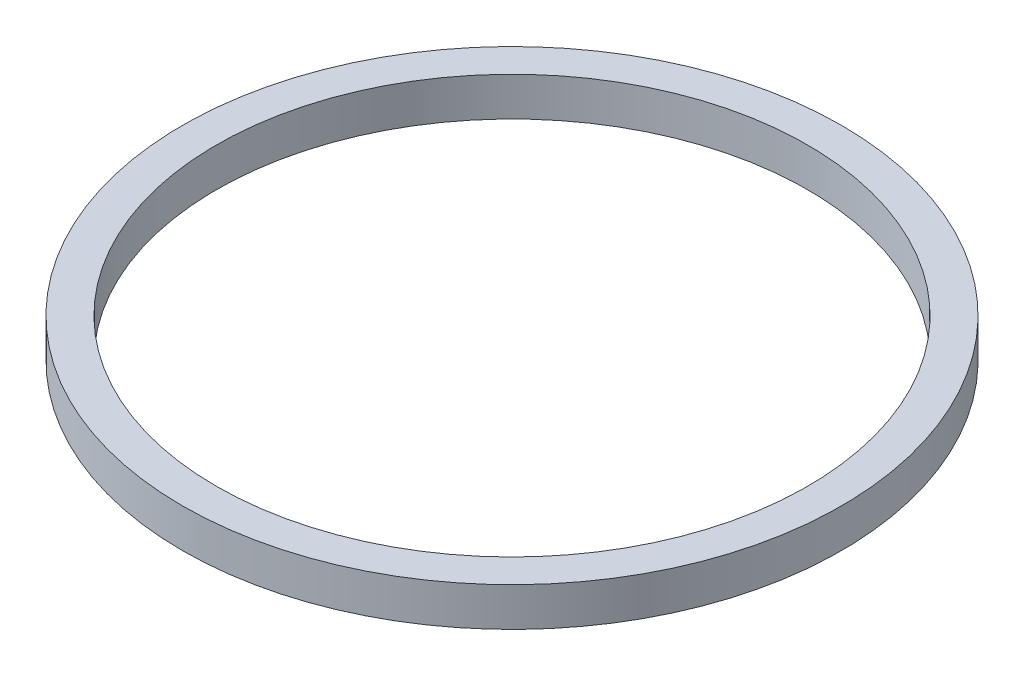
ISO-10303-21;
HEADER;
FILE_DESCRIPTION(('STEP AP214'),'2;1');
FILE_NAME('part.step','',(''),(''),'','','');
FILE_SCHEMA(('AUTOMOTIVE_DESIGN { 1 0 10303 214 1 1 1 1 }'));
ENDSEC;
DATA;
#1=APPLICATION_CONTEXT('core data for automotive mechanical design processes');
#2=APPLICATION_PROTOCOL_DEFINITION('international standard','automotive_design',2000,#1);
#3=PRODUCT_CONTEXT('',#1,'mechanical');
#4=PRODUCT('Part','Part','',(#3));
#5=PRODUCT_RELATED_PRODUCT_CATEGORY('part','',(#4));
#6=PRODUCT_DEFINITION_FORMATION('','',#4);
#7=PRODUCT_DEFINITION_CONTEXT('part definition',#1,'design');
#8=PRODUCT_DEFINITION('design','',#6,#7);
#9=PRODUCT_DEFINITION_SHAPE('','',#8);
#10=(LENGTH_UNIT() NAMED_UNIT(*) SI_UNIT(.MILLI.,.METRE.));
#11=(NAMED_UNIT(*) PLANE_ANGLE_UNIT() SI_UNIT($,.RADIAN.));
#12=(NAMED_UNIT(*) SI_UNIT($,.STERADIAN.) SOLID_ANGLE_UNIT());
#13=UNCERTAINTY_MEASURE_WITH_UNIT(LENGTH_MEASURE(1.E-05),#10,'distance_accuracy_value','');
#14=(GEOMETRIC_REPRESENTATION_CONTEXT(3) GLOBAL_UNCERTAINTY_ASSIGNED_CONTEXT((#13)) GLOBAL_UNIT_ASSIGNED_CONTEXT((#10,
#11,#12)) REPRESENTATION_CONTEXT('',''));
#15=CARTESIAN_POINT('',(0.,0.,0.));
#16=DIRECTION('',(0.,0.,1.));
#17=DIRECTION('',(1.,0.,0.));
#18=AXIS2_PLACEMENT_3D('',#15,#16,#17);
#19=CARTESIAN_POINT('',(0.,0.2,0.));
#20=DIRECTION('',(0.,1.,0.));
#21=DIRECTION('',(0.,0.,1.));
#22=AXIS2_PLACEMENT_3D('',#19,#20,#21);
#23=PLANE('',#22);
#24=CARTESIAN_POINT('',(0.,0.2,0.));
#25=DIRECTION('',(0.,1.,0.));
#26=DIRECTION('',(0.,0.,1.));
#27=AXIS2_PLACEMENT_3D('',#24,#25,#26);
#28=CIRCLE('',#27,3.4);
#29=CARTESIAN_POINT('',(0.,0.2,3.4));
#30=VERTEX_POINT('',#29);
#31=EDGE_CURVE('E11',#30,#30,#28,.T.);
#32=ORIENTED_EDGE('',*,*,#31,.T.);
#33=EDGE_LOOP('',(#32));
#34=FACE_BOUND('',#33,.T.);
#35=CARTESIAN_POINT('',(0.,0.2,0.));
#36=DIRECTION('',(0.,1.,0.));
#37=DIRECTION('',(0.,0.,1.));
#38=AXIS2_PLACEMENT_3D('',#35,#36,#37);
#39=CIRCLE('',#38,3.05);
#40=CARTESIAN_POINT('',(0.,0.2,3.05));
#41=VERTEX_POINT('',#40);
#42=EDGE_CURVE('E50',#41,#41,#39,.T.);
#43=ORIENTED_EDGE('',*,*,#42,.F.);
#44=EDGE_LOOP('',(#43));
#45=FACE_BOUND('',#44,.T.);
#46=ADVANCED_FACE('F39',(#34,#45),#23,.T.);
#47=CARTESIAN_POINT('',(0.,-0.2,0.));
#48=DIRECTION('',(0.,1.,0.));
#49=DIRECTION('',(0.,0.,1.));
#50=AXIS2_PLACEMENT_3D('',#47,#48,#49);
#51=PLANE('',#50);
#52=CARTESIAN_POINT('',(0.,-0.2,0.));
#53=DIRECTION('',(0.,1.,0.));
#54=DIRECTION('',(0.,0.,1.));
#55=AXIS2_PLACEMENT_3D('',#52,#53,#54);
#56=CIRCLE('',#55,3.4);
#57=CARTESIAN_POINT('',(0.,-0.2,3.4));
#58=VERTEX_POINT('',#57);
#59=EDGE_CURVE('E43',#58,#58,#56,.T.);
#60=ORIENTED_EDGE('',*,*,#59,.F.);
#61=EDGE_LOOP('',(#60));
#62=FACE_BOUND('',#61,.T.);
#63=CARTESIAN_POINT('',(0.,-0.2,0.));
#64=DIRECTION('',(0.,1.,0.));
#65=DIRECTION('',(0.,0.,1.));
#66=AXIS2_PLACEMENT_3D('',#63,#64,#65);
#67=CIRCLE('',#66,3.05);
#68=CARTESIAN_POINT('',(0.,-0.2,3.05));
#69=VERTEX_POINT('',#68);
#70=EDGE_CURVE('E52',#69,#69,#67,.T.);
#71=ORIENTED_EDGE('',*,*,#70,.T.);
#72=EDGE_LOOP('',(#71));
#73=FACE_BOUND('',#72,.T.);
#74=ADVANCED_FACE('F62',(#62,#73),#51,.F.);
#75=CARTESIAN_POINT('',(0.,0.2,0.));
#76=DIRECTION('',(0.,-1.,0.));
#77=DIRECTION('',(0.,0.,-1.));
#78=AXIS2_PLACEMENT_3D('',#75,#76,#77);
#79=CYLINDRICAL_SURFACE('',#78,3.4);
#80=ORIENTED_EDGE('',*,*,#31,.F.);
#81=EDGE_LOOP('',(#80));
#82=FACE_BOUND('',#81,.T.);
#83=ORIENTED_EDGE('',*,*,#59,.T.);
#84=EDGE_LOOP('',(#83));
#85=FACE_BOUND('',#84,.T.);
#86=ADVANCED_FACE('F41',(#82,#85),#79,.T.);
#87=CARTESIAN_POINT('',(0.,0.2,0.));
#88=DIRECTION('',(0.,-1.,0.));
#89=DIRECTION('',(0.,0.,-1.));
#90=AXIS2_PLACEMENT_3D('',#87,#88,#89);
#91=CYLINDRICAL_SURFACE('',#90,3.05);
#92=ORIENTED_EDGE('',*,*,#42,.T.);
#93=EDGE_LOOP('',(#92));
#94=FACE_BOUND('',#93,.T.);
#95=ORIENTED_EDGE('',*,*,#70,.F.);
#96=EDGE_LOOP('',(#95));
#97=FACE_BOUND('',#96,.T.);
#98=ADVANCED_FACE('F58',(#94,#97),#91,.F.);
#99=CLOSED_SHELL('',(#46,#74,#86,#98));
#100=MANIFOLD_SOLID_BREP('B2',#99);
#101=ADVANCED_BREP_SHAPE_REPRESENTATION('',(#18,#100),#14);
#102=SHAPE_DEFINITION_REPRESENTATION(#9,#101);
ENDSEC;
END-ISO-10303-21;
